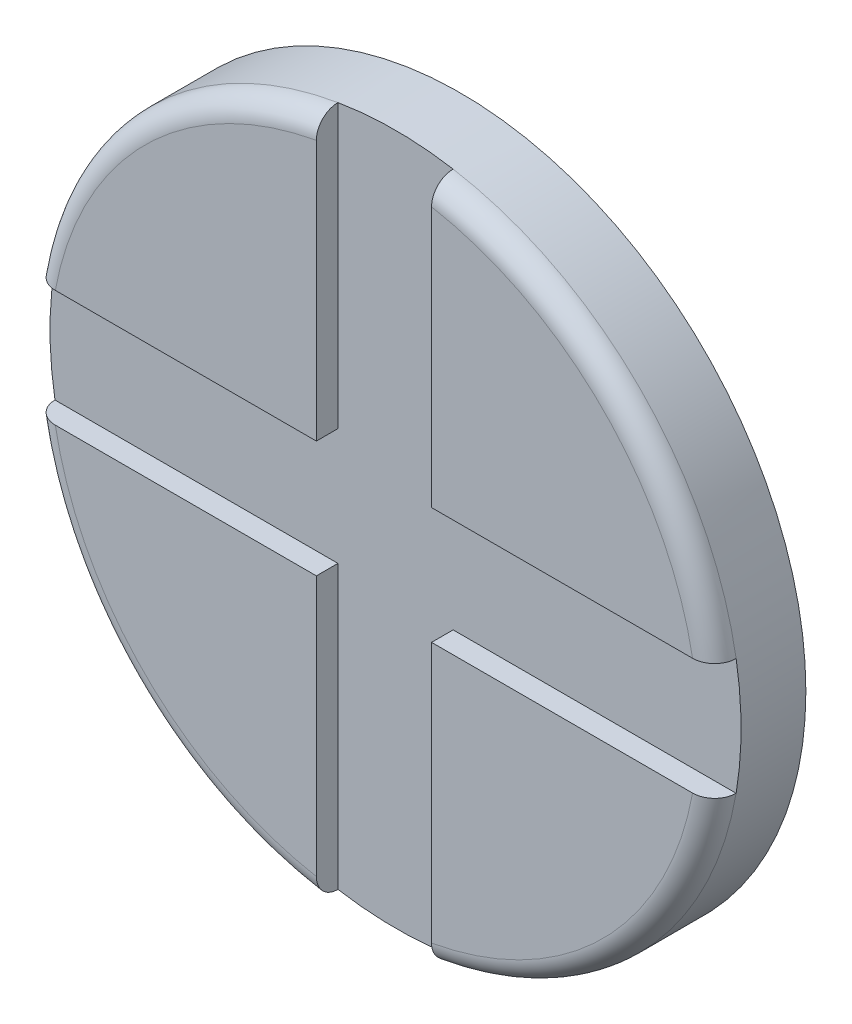
ISO-10303-21;
HEADER;
FILE_DESCRIPTION(('STEP AP214'),'2;1');
FILE_NAME('part.step','',(''),(''),'','','');
FILE_SCHEMA(('AUTOMOTIVE_DESIGN { 1 0 10303 214 1 1 1 1 }'));
ENDSEC;
DATA;
#1=APPLICATION_CONTEXT('core data for automotive mechanical design processes');
#2=APPLICATION_PROTOCOL_DEFINITION('international standard','automotive_design',2000,#1);
#3=PRODUCT_CONTEXT('',#1,'mechanical');
#4=PRODUCT('Part','Part','',(#3));
#5=PRODUCT_RELATED_PRODUCT_CATEGORY('part','',(#4));
#6=PRODUCT_DEFINITION_FORMATION('','',#4);
#7=PRODUCT_DEFINITION_CONTEXT('part definition',#1,'design');
#8=PRODUCT_DEFINITION('design','',#6,#7);
#9=PRODUCT_DEFINITION_SHAPE('','',#8);
#10=(LENGTH_UNIT() NAMED_UNIT(*) SI_UNIT(.MILLI.,.METRE.));
#11=(NAMED_UNIT(*) PLANE_ANGLE_UNIT() SI_UNIT($,.RADIAN.));
#12=(NAMED_UNIT(*) SI_UNIT($,.STERADIAN.) SOLID_ANGLE_UNIT());
#13=UNCERTAINTY_MEASURE_WITH_UNIT(LENGTH_MEASURE(1.E-05),#10,'distance_accuracy_value','');
#14=(GEOMETRIC_REPRESENTATION_CONTEXT(3) GLOBAL_UNCERTAINTY_ASSIGNED_CONTEXT((#13)) GLOBAL_UNIT_ASSIGNED_CONTEXT((#10,
#11,#12)) REPRESENTATION_CONTEXT('',''));
#15=CARTESIAN_POINT('',(0.,0.,0.));
#16=DIRECTION('',(0.,0.,1.));
#17=DIRECTION('',(1.,0.,0.));
#18=AXIS2_PLACEMENT_3D('',#15,#16,#17);
#19=CARTESIAN_POINT('',(0.,0.,1.));
#20=DIRECTION('',(0.,0.,1.));
#21=DIRECTION('',(1.,0.,0.));
#22=AXIS2_PLACEMENT_3D('',#19,#20,#21);
#23=PLANE('',#22);
#24=DIRECTION('',(0.,-1.,0.));
#25=VECTOR('',#24,1.);
#26=CARTESIAN_POINT('',(-0.666748585237763,0.,1.));
#27=LINE('',#26,#25);
#28=CARTESIAN_POINT('',(-0.666748585237763,3.69025017093468,1.));
#29=VERTEX_POINT('',#28);
#30=CARTESIAN_POINT('',(-0.666748585237763,0.675521592938265,1.));
#31=VERTEX_POINT('',#30);
#32=EDGE_CURVE('E223',#29,#31,#27,.T.);
#33=ORIENTED_EDGE('',*,*,#32,.F.);
#34=CARTESIAN_POINT('',(0.,0.,1.));
#35=DIRECTION('',(0.,0.,1.));
#36=DIRECTION('',(1.,0.,0.));
#37=AXIS2_PLACEMENT_3D('',#34,#35,#36);
#38=CIRCLE('',#37,3.75);
#39=CARTESIAN_POINT('',(-3.6886543044143,0.675521592938265,1.));
#40=VERTEX_POINT('',#39);
#41=EDGE_CURVE('E320',#29,#40,#38,.T.);
#42=ORIENTED_EDGE('',*,*,#41,.T.);
#43=DIRECTION('',(-1.,0.,0.));
#44=VECTOR('',#43,1.);
#45=CARTESIAN_POINT('',(-8.10625911525913,0.675521592938265,1.));
#46=LINE('',#45,#44);
#47=EDGE_CURVE('E148',#31,#40,#46,.T.);
#48=ORIENTED_EDGE('',*,*,#47,.F.);
#49=EDGE_LOOP('',(#33,#42,#48));
#50=FACE_BOUND('',#49,.T.);
#51=ADVANCED_FACE('F38',(#50),#23,.T.);
#52=DIRECTION('',(-1.,0.,0.));
#53=VECTOR('',#52,1.);
#54=CARTESIAN_POINT('',(0.,0.675521592938265,1.));
#55=LINE('',#54,#53);
#56=CARTESIAN_POINT('',(3.6886543044143,0.675521592938265,1.));
#57=VERTEX_POINT('',#56);
#58=CARTESIAN_POINT('',(0.666748585237763,0.675521592938265,1.));
#59=VERTEX_POINT('',#58);
#60=EDGE_CURVE('E220',#57,#59,#55,.T.);
#61=ORIENTED_EDGE('',*,*,#60,.F.);
#62=CARTESIAN_POINT('',(0.,0.,1.));
#63=DIRECTION('',(0.,0.,1.));
#64=DIRECTION('',(1.,0.,0.));
#65=AXIS2_PLACEMENT_3D('',#62,#63,#64);
#66=CIRCLE('',#65,3.75);
#67=CARTESIAN_POINT('',(0.666748585237763,3.69025017093468,1.));
#68=VERTEX_POINT('',#67);
#69=EDGE_CURVE('E232',#57,#68,#66,.T.);
#70=ORIENTED_EDGE('',*,*,#69,.T.);
#71=DIRECTION('',(0.,1.,0.));
#72=VECTOR('',#71,1.);
#73=CARTESIAN_POINT('',(0.666748585237763,0.675521592938265,1.));
#74=LINE('',#73,#72);
#75=EDGE_CURVE('E193',#59,#68,#74,.T.);
#76=ORIENTED_EDGE('',*,*,#75,.F.);
#77=EDGE_LOOP('',(#61,#70,#76));
#78=FACE_BOUND('',#77,.T.);
#79=ADVANCED_FACE('F339',(#78),#23,.T.);
#80=DIRECTION('',(0.,1.,0.));
#81=VECTOR('',#80,1.);
#82=CARTESIAN_POINT('',(0.666748585237763,0.,1.));
#83=LINE('',#82,#81);
#84=CARTESIAN_POINT('',(0.666748585237763,-3.69025017093468,1.));
#85=VERTEX_POINT('',#84);
#86=CARTESIAN_POINT('',(0.666748585237763,-0.675521592938265,1.));
#87=VERTEX_POINT('',#86);
#88=EDGE_CURVE('E217',#85,#87,#83,.T.);
#89=ORIENTED_EDGE('',*,*,#88,.F.);
#90=CARTESIAN_POINT('',(0.,0.,1.));
#91=DIRECTION('',(0.,0.,1.));
#92=DIRECTION('',(1.,0.,0.));
#93=AXIS2_PLACEMENT_3D('',#90,#91,#92);
#94=CIRCLE('',#93,3.75);
#95=CARTESIAN_POINT('',(3.6886543044143,-0.675521592938265,1.));
#96=VERTEX_POINT('',#95);
#97=EDGE_CURVE('E276',#85,#96,#94,.T.);
#98=ORIENTED_EDGE('',*,*,#97,.T.);
#99=DIRECTION('',(1.,0.,0.));
#100=VECTOR('',#99,1.);
#101=CARTESIAN_POINT('',(8.10625911525913,-0.675521592938265,1.));
#102=LINE('',#101,#100);
#103=EDGE_CURVE('E189',#87,#96,#102,.T.);
#104=ORIENTED_EDGE('',*,*,#103,.F.);
#105=EDGE_LOOP('',(#89,#98,#104));
#106=FACE_BOUND('',#105,.T.);
#107=ADVANCED_FACE('F331',(#106),#23,.T.);
#108=CARTESIAN_POINT('',(0.,0.,1.));
#109=DIRECTION('',(0.,0.,-1.));
#110=DIRECTION('',(-1.,0.,0.));
#111=AXIS2_PLACEMENT_3D('',#108,#109,#110);
#112=CYLINDRICAL_SURFACE('',#111,4.);
#113=CARTESIAN_POINT('',(0.,0.,0.75));
#114=DIRECTION('',(0.,0.,1.));
#115=DIRECTION('',(1.,0.,0.));
#116=AXIS2_PLACEMENT_3D('',#113,#114,#115);
#117=CIRCLE('',#116,4.);
#118=CARTESIAN_POINT('',(0.666748585237763,3.94403934109226,0.75));
#119=VERTEX_POINT('',#118);
#120=CARTESIAN_POINT('',(-0.666748585237763,3.94403934109226,0.75));
#121=VERTEX_POINT('',#120);
#122=EDGE_CURVE('E231',#119,#121,#117,.T.);
#123=ORIENTED_EDGE('',*,*,#122,.F.);
#124=CARTESIAN_POINT('',(0.,0.,0.75));
#125=DIRECTION('',(0.,0.,1.));
#126=DIRECTION('',(1.,0.,0.));
#127=AXIS2_PLACEMENT_3D('',#124,#125,#126);
#128=CIRCLE('',#127,4.);
#129=CARTESIAN_POINT('',(3.9425462048623,0.675521592938265,0.75));
#130=VERTEX_POINT('',#129);
#131=EDGE_CURVE('E277',#119,#130,#128,.F.);
#132=ORIENTED_EDGE('',*,*,#131,.T.);
#133=CARTESIAN_POINT('',(3.9425462048623,-0.675521592938265,0.75));
#134=VERTEX_POINT('',#133);
#135=EDGE_CURVE('E226',#134,#130,#117,.T.);
#136=ORIENTED_EDGE('',*,*,#135,.F.);
#137=CARTESIAN_POINT('',(0.,0.,0.75));
#138=DIRECTION('',(0.,0.,1.));
#139=DIRECTION('',(1.,0.,0.));
#140=AXIS2_PLACEMENT_3D('',#137,#138,#139);
#141=CIRCLE('',#140,4.);
#142=CARTESIAN_POINT('',(0.666748585237763,-3.94403934109226,0.75));
#143=VERTEX_POINT('',#142);
#144=EDGE_CURVE('E504',#134,#143,#141,.F.);
#145=ORIENTED_EDGE('',*,*,#144,.T.);
#146=CARTESIAN_POINT('',(-0.666748585237763,-3.94403934109226,0.75));
#147=VERTEX_POINT('',#146);
#148=EDGE_CURVE('E230',#147,#143,#117,.T.);
#149=ORIENTED_EDGE('',*,*,#148,.F.);
#150=CARTESIAN_POINT('',(0.,0.,0.75));
#151=DIRECTION('',(0.,0.,1.));
#152=DIRECTION('',(1.,0.,0.));
#153=AXIS2_PLACEMENT_3D('',#150,#151,#152);
#154=CIRCLE('',#153,4.);
#155=CARTESIAN_POINT('',(-3.9425462048623,-0.675521592938265,0.75));
#156=VERTEX_POINT('',#155);
#157=EDGE_CURVE('E511',#147,#156,#154,.F.);
#158=ORIENTED_EDGE('',*,*,#157,.T.);
#159=CARTESIAN_POINT('',(-3.9425462048623,0.675521592938265,0.75));
#160=VERTEX_POINT('',#159);
#161=EDGE_CURVE('E144',#160,#156,#117,.T.);
#162=ORIENTED_EDGE('',*,*,#161,.F.);
#163=CARTESIAN_POINT('',(0.,0.,0.75));
#164=DIRECTION('',(0.,0.,1.));
#165=DIRECTION('',(1.,0.,0.));
#166=AXIS2_PLACEMENT_3D('',#163,#164,#165);
#167=CIRCLE('',#166,4.);
#168=EDGE_CURVE('E245',#160,#121,#167,.F.);
#169=ORIENTED_EDGE('',*,*,#168,.T.);
#170=EDGE_LOOP('',(#123,#132,#136,#145,#149,#158,#162,#169));
#171=FACE_BOUND('',#170,.T.);
#172=CARTESIAN_POINT('',(0.,0.,0.));
#173=DIRECTION('',(0.,0.,1.));
#174=DIRECTION('',(1.,0.,0.));
#175=AXIS2_PLACEMENT_3D('',#172,#173,#174);
#176=CIRCLE('',#175,4.);
#177=CARTESIAN_POINT('',(4.,0.,0.));
#178=VERTEX_POINT('',#177);
#179=EDGE_CURVE('E204',#178,#178,#176,.T.);
#180=ORIENTED_EDGE('',*,*,#179,.T.);
#181=EDGE_LOOP('',(#180));
#182=FACE_BOUND('',#181,.T.);
#183=ADVANCED_FACE('F329',(#171,#182),#112,.T.);
#184=DIRECTION('',(1.,0.,0.));
#185=VECTOR('',#184,1.);
#186=CARTESIAN_POINT('',(0.,-0.675521592938265,1.));
#187=LINE('',#186,#185);
#188=CARTESIAN_POINT('',(-3.6886543044143,-0.675521592938265,1.));
#189=VERTEX_POINT('',#188);
#190=CARTESIAN_POINT('',(-0.666748585237763,-0.675521592938265,1.));
#191=VERTEX_POINT('',#190);
#192=EDGE_CURVE('E154',#189,#191,#187,.T.);
#193=ORIENTED_EDGE('',*,*,#192,.F.);
#194=CARTESIAN_POINT('',(0.,0.,1.));
#195=DIRECTION('',(0.,0.,1.));
#196=DIRECTION('',(1.,0.,0.));
#197=AXIS2_PLACEMENT_3D('',#194,#195,#196);
#198=CIRCLE('',#197,3.75);
#199=CARTESIAN_POINT('',(-0.666748585237763,-3.69025017093468,1.));
#200=VERTEX_POINT('',#199);
#201=EDGE_CURVE('E506',#189,#200,#198,.T.);
#202=ORIENTED_EDGE('',*,*,#201,.T.);
#203=DIRECTION('',(0.,-1.,0.));
#204=VECTOR('',#203,1.);
#205=CARTESIAN_POINT('',(-0.666748585237763,-0.675521592938265,1.));
#206=LINE('',#205,#204);
#207=EDGE_CURVE('E186',#191,#200,#206,.T.);
#208=ORIENTED_EDGE('',*,*,#207,.F.);
#209=EDGE_LOOP('',(#193,#202,#208));
#210=FACE_BOUND('',#209,.T.);
#211=ADVANCED_FACE('F325',(#210),#23,.T.);
#212=CARTESIAN_POINT('',(0.,0.,0.));
#213=DIRECTION('',(0.,0.,1.));
#214=DIRECTION('',(1.,0.,0.));
#215=AXIS2_PLACEMENT_3D('',#212,#213,#214);
#216=PLANE('',#215);
#217=ORIENTED_EDGE('',*,*,#179,.F.);
#218=EDGE_LOOP('',(#217));
#219=FACE_BOUND('',#218,.T.);
#220=ADVANCED_FACE('F328',(#219),#216,.F.);
#221=CARTESIAN_POINT('',(0.,0.,0.75));
#222=DIRECTION('',(0.,0.,1.));
#223=DIRECTION('',(1.,0.,0.));
#224=AXIS2_PLACEMENT_3D('',#221,#222,#223);
#225=PLANE('',#224);
#226=ORIENTED_EDGE('',*,*,#122,.T.);
#227=DIRECTION('',(0.,-1.,0.));
#228=VECTOR('',#227,1.);
#229=CARTESIAN_POINT('',(-0.666748585237763,0.675521592938265,0.75));
#230=LINE('',#229,#228);
#231=CARTESIAN_POINT('',(-0.666748585237763,0.675521592938265,0.75));
#232=VERTEX_POINT('',#231);
#233=EDGE_CURVE('E181',#121,#232,#230,.T.);
#234=ORIENTED_EDGE('',*,*,#233,.T.);
#235=DIRECTION('',(-1.,0.,0.));
#236=VECTOR('',#235,1.);
#237=CARTESIAN_POINT('',(-8.10625911525913,0.675521592938265,0.75));
#238=LINE('',#237,#236);
#239=EDGE_CURVE('E160',#232,#160,#238,.T.);
#240=ORIENTED_EDGE('',*,*,#239,.T.);
#241=ORIENTED_EDGE('',*,*,#161,.T.);
#242=DIRECTION('',(1.,0.,0.));
#243=VECTOR('',#242,1.);
#244=CARTESIAN_POINT('',(-8.10625911525913,-0.675521592938265,0.75));
#245=LINE('',#244,#243);
#246=CARTESIAN_POINT('',(-0.666748585237763,-0.675521592938265,0.75));
#247=VERTEX_POINT('',#246);
#248=EDGE_CURVE('E134',#156,#247,#245,.T.);
#249=ORIENTED_EDGE('',*,*,#248,.T.);
#250=DIRECTION('',(0.,-1.,0.));
#251=VECTOR('',#250,1.);
#252=CARTESIAN_POINT('',(-0.666748585237763,-0.675521592938265,0.75));
#253=LINE('',#252,#251);
#254=EDGE_CURVE('E140',#247,#147,#253,.T.);
#255=ORIENTED_EDGE('',*,*,#254,.T.);
#256=ORIENTED_EDGE('',*,*,#148,.T.);
#257=DIRECTION('',(0.,1.,0.));
#258=VECTOR('',#257,1.);
#259=CARTESIAN_POINT('',(0.666748585237763,-0.675521592938265,0.75));
#260=LINE('',#259,#258);
#261=CARTESIAN_POINT('',(0.666748585237763,-0.675521592938265,0.75));
#262=VERTEX_POINT('',#261);
#263=EDGE_CURVE('E165',#143,#262,#260,.T.);
#264=ORIENTED_EDGE('',*,*,#263,.T.);
#265=DIRECTION('',(1.,0.,0.));
#266=VECTOR('',#265,1.);
#267=CARTESIAN_POINT('',(8.10625911525913,-0.675521592938265,0.75));
#268=LINE('',#267,#266);
#269=EDGE_CURVE('E168',#262,#134,#268,.T.);
#270=ORIENTED_EDGE('',*,*,#269,.T.);
#271=ORIENTED_EDGE('',*,*,#135,.T.);
#272=DIRECTION('',(-1.,0.,0.));
#273=VECTOR('',#272,1.);
#274=CARTESIAN_POINT('',(8.10625911525913,0.675521592938265,0.75));
#275=LINE('',#274,#273);
#276=CARTESIAN_POINT('',(0.666748585237763,0.675521592938265,0.75));
#277=VERTEX_POINT('',#276);
#278=EDGE_CURVE('E174',#130,#277,#275,.T.);
#279=ORIENTED_EDGE('',*,*,#278,.T.);
#280=DIRECTION('',(0.,1.,0.));
#281=VECTOR('',#280,1.);
#282=CARTESIAN_POINT('',(0.666748585237763,0.675521592938265,0.75));
#283=LINE('',#282,#281);
#284=EDGE_CURVE('E177',#277,#119,#283,.T.);
#285=ORIENTED_EDGE('',*,*,#284,.T.);
#286=EDGE_LOOP('',(#226,#234,#240,#241,#249,#255,#256,#264,#270,#271,#279,#285));
#287=FACE_BOUND('',#286,.T.);
#288=ADVANCED_FACE('F137',(#287),#225,.T.);
#289=CARTESIAN_POINT('',(-8.10625911525913,0.675521592938265,0.75));
#290=DIRECTION('',(0.,1.,0.));
#291=DIRECTION('',(0.,0.,1.));
#292=AXIS2_PLACEMENT_3D('',#289,#290,#291);
#293=PLANE('',#292);
#294=ORIENTED_EDGE('',*,*,#47,.T.);
#295=CARTESIAN_POINT('',(-3.6886543044143,0.675521592938265,1.));
#296=CARTESIAN_POINT('',(-3.70310732693374,0.675521592938265,1.00001127598534));
#297=CARTESIAN_POINT('',(-3.71755855747042,0.675521592938265,0.998787956112983));
#298=CARTESIAN_POINT('',(-3.7460513541776,0.675521592938265,0.993950378422715));
#299=CARTESIAN_POINT('',(-3.76009303043003,0.675521592938265,0.990336769378082));
#300=CARTESIAN_POINT('',(-3.78737826603027,0.675521592938265,0.980793518963055));
#301=CARTESIAN_POINT('',(-3.80062127165866,0.675521592938265,0.974862291616754));
#302=CARTESIAN_POINT('',(-3.82590821675511,0.675521592938265,0.960844780389209));
#303=CARTESIAN_POINT('',(-3.83795255062412,0.675521592938265,0.952759208596884));
#304=CARTESIAN_POINT('',(-3.86039160695859,0.675521592938265,0.934726856361812));
#305=CARTESIAN_POINT('',(-3.87079924889062,0.675521592938265,0.924796160049689));
#306=CARTESIAN_POINT('',(-3.88977137986955,0.675521592938265,0.903302293427657));
#307=CARTESIAN_POINT('',(-3.89833556020725,0.675521592938265,0.891738850231263));
#308=CARTESIAN_POINT('',(-3.91324111555958,0.675521592938265,0.867492898699393));
#309=CARTESIAN_POINT('',(-3.91961311837463,0.675521592938265,0.854829193861606));
#310=CARTESIAN_POINT('',(-3.93010509521709,0.675521592938265,0.828605732312696));
#311=CARTESIAN_POINT('',(-3.93422686729584,0.675521592938265,0.815046700754817));
#312=CARTESIAN_POINT('',(-3.93895057283187,0.675521592938265,0.792821686490286));
#313=CARTESIAN_POINT('',(-3.94029818313135,0.675521592938265,0.784307176572258));
#314=CARTESIAN_POINT('',(-3.94209575964959,0.675521592938265,0.767196422330136));
#315=CARTESIAN_POINT('',(-3.94254702295186,0.675521592938265,0.758600314224204));
#316=CARTESIAN_POINT('',(-3.94254620486291,0.675521592938265,0.75000000000013));
#317=B_SPLINE_CURVE_WITH_KNOTS('',3,(#295,#296,#297,#298,#299,#300,#301,#302,#303,#304,#305,
#306,#307,#308,#309,#310,#311,#312,#313,#314,#315,#316),.UNSPECIFIED.,.F.,.F.,(4,2,2,2,2,2,2,2,
2,2,4),(0.,0.043305090437867,0.0865984318104516,0.129921451402074,0.173230168891926,
0.216177707870744,0.25913243333153,0.30146001145255,0.343753717950218,0.369572002496621,
0.395352898688334),.UNSPECIFIED.);
#318=EDGE_CURVE('E53',#40,#160,#317,.T.);
#319=ORIENTED_EDGE('',*,*,#318,.T.);
#320=ORIENTED_EDGE('',*,*,#239,.F.);
#321=DIRECTION('',(0.,0.,1.));
#322=VECTOR('',#321,1.);
#323=CARTESIAN_POINT('',(-0.666748585237763,0.675521592938265,0.75));
#324=LINE('',#323,#322);
#325=EDGE_CURVE('E200',#232,#31,#324,.T.);
#326=ORIENTED_EDGE('',*,*,#325,.T.);
#327=EDGE_LOOP('',(#294,#319,#320,#326));
#328=FACE_BOUND('',#327,.T.);
#329=ADVANCED_FACE('F360',(#328),#293,.F.);
#330=CARTESIAN_POINT('',(-0.666748585237763,0.675521592938265,0.75));
#331=DIRECTION('',(-1.,0.,0.));
#332=DIRECTION('',(0.,0.,1.));
#333=AXIS2_PLACEMENT_3D('',#330,#331,#332);
#334=PLANE('',#333);
#335=ORIENTED_EDGE('',*,*,#233,.F.);
#336=CARTESIAN_POINT('',(-0.666748585237763,3.94403934109226,0.75));
#337=CARTESIAN_POINT('',(-0.666748585237763,3.94405205652654,0.763919490419354));
#338=CARTESIAN_POINT('',(-0.666748585237763,3.94286112880237,0.777834314337653));
#339=CARTESIAN_POINT('',(-0.666748585237763,3.93816711508049,0.805252345670028));
#340=CARTESIAN_POINT('',(-0.666748585237763,3.93466672845274,0.81875601440157));
#341=CARTESIAN_POINT('',(-0.666748585237763,3.92544690266873,0.844988337710214));
#342=CARTESIAN_POINT('',(-0.666748585237763,3.91972668495071,0.857716718556322));
#343=CARTESIAN_POINT('',(-0.666748585237763,3.90624410138709,0.882039111517386));
#344=CARTESIAN_POINT('',(-0.666748585237763,3.89848187897486,0.893633203228018));
#345=CARTESIAN_POINT('',(-0.666748585237763,3.8810917768444,0.915437207278206));
#346=CARTESIAN_POINT('',(-0.666748585237763,3.87145320896662,0.925638591378647));
#347=CARTESIAN_POINT('',(-0.666748585237763,3.85061857653182,0.944305965555218));
#348=CARTESIAN_POINT('',(-0.666748585237763,3.83942218221737,0.952771587267843));
#349=CARTESIAN_POINT('',(-0.666748585237763,3.81563153434135,0.967847660627358));
#350=CARTESIAN_POINT('',(-0.666748585237763,3.80302044618687,0.974431516942081));
#351=CARTESIAN_POINT('',(-0.666748585237763,3.77688406350836,0.985419445689757));
#352=CARTESIAN_POINT('',(-0.666748585237763,3.76335909780451,0.989824297448384));
#353=CARTESIAN_POINT('',(-0.666748585237763,3.73985393572141,0.995383870522443));
#354=CARTESIAN_POINT('',(-0.666748585237763,3.7300057115501,0.997114146193454));
#355=CARTESIAN_POINT('',(-0.666748585237763,3.71018952598286,0.999422151464049));
#356=CARTESIAN_POINT('',(-0.666748585237763,3.70022175777955,1.00000153985163));
#357=CARTESIAN_POINT('',(-0.666748585237763,3.69025017093524,1.00000000000235));
#358=B_SPLINE_CURVE_WITH_KNOTS('',3,(#336,#337,#338,#339,#340,#341,#342,#343,#344,#345,#346,
#347,#348,#349,#350,#351,#352,#353,#354,#355,#356,#357),.UNSPECIFIED.,.F.,.F.,(4,2,2,2,2,2,2,2,
2,2,4),(0.,0.0417007199634953,0.083352784926031,0.125019471747011,0.16668323262046,
0.208591658693856,0.250508969389248,0.292992318204482,0.335460461753297,0.365394099536715,
0.39528456220413),.UNSPECIFIED.);
#359=EDGE_CURVE('E11',#121,#29,#358,.T.);
#360=ORIENTED_EDGE('',*,*,#359,.T.);
#361=ORIENTED_EDGE('',*,*,#32,.T.);
#362=ORIENTED_EDGE('',*,*,#325,.F.);
#363=EDGE_LOOP('',(#335,#360,#361,#362));
#364=FACE_BOUND('',#363,.T.);
#365=ADVANCED_FACE('F256',(#364),#334,.F.);
#366=CARTESIAN_POINT('',(0.666748585237763,0.675521592938265,0.75));
#367=DIRECTION('',(1.,0.,0.));
#368=DIRECTION('',(0.,0.,-1.));
#369=AXIS2_PLACEMENT_3D('',#366,#367,#368);
#370=PLANE('',#369);
#371=ORIENTED_EDGE('',*,*,#75,.T.);
#372=CARTESIAN_POINT('',(0.666748585237763,3.69025017093468,1.));
#373=CARTESIAN_POINT('',(0.666748585237763,3.70469281084056,1.00001129412914));
#374=CARTESIAN_POINT('',(0.666748585237763,3.71913361064892,0.998788652243084));
#375=CARTESIAN_POINT('',(0.666748585237763,3.74760557457344,0.993954018988125));
#376=CARTESIAN_POINT('',(0.666748585237763,3.76163685429154,0.990342708854178));
#377=CARTESIAN_POINT('',(0.666748585237763,3.78890178280757,0.980805937473574));
#378=CARTESIAN_POINT('',(0.666748585237763,3.80213488267888,0.974878904134002));
#379=CARTESIAN_POINT('',(0.666748585237763,3.82740323328719,0.960871882375406));
#380=CARTESIAN_POINT('',(0.666748585237763,3.83943887308997,0.952792596401267));
#381=CARTESIAN_POINT('',(0.666748585237763,3.86186510001276,0.934772894405005));
#382=CARTESIAN_POINT('',(0.666748585237763,3.87226824129386,0.924848109575875));
#383=CARTESIAN_POINT('',(0.666748585237763,3.89123325488261,0.90336738484439));
#384=CARTESIAN_POINT('',(0.666748585237763,3.8997948172229,0.891811170887603));
#385=CARTESIAN_POINT('',(0.666748585237763,3.91470069975872,0.867575813712456));
#386=CARTESIAN_POINT('',(0.666748585237763,3.92107479908467,0.854914961462661));
#387=CARTESIAN_POINT('',(0.666748585237763,3.93157227148094,0.828697029173902));
#388=CARTESIAN_POINT('',(0.666748585237763,3.93569742882055,0.815140669216964));
#389=CARTESIAN_POINT('',(0.666748585237763,3.94043138242656,0.79290259842064));
#390=CARTESIAN_POINT('',(0.666748585237763,3.94178361046471,0.784372176612822));
#391=CARTESIAN_POINT('',(0.666748585237763,3.94358735295009,0.767229147430427));
#392=CARTESIAN_POINT('',(0.666748585237763,3.9440401681882,0.758616676873956));
#393=CARTESIAN_POINT('',(0.666748585237763,3.94403934109288,0.750000000000133));
#394=B_SPLINE_CURVE_WITH_KNOTS('',3,(#372,#373,#374,#375,#376,#377,#378,#379,#380,#381,#382,
#383,#384,#385,#386,#387,#388,#389,#390,#391,#392,#393),.UNSPECIFIED.,.F.,.F.,(4,2,2,2,2,2,2,2,
2,2,4),(0.,0.0432738864839497,0.0865354368133695,0.129826407620303,0.173103266541659,
0.216029019001054,0.258961990910999,0.301284865599284,0.343574113048515,0.369441477109639,
0.39527140274089),.UNSPECIFIED.);
#395=EDGE_CURVE('E236',#68,#119,#394,.T.);
#396=ORIENTED_EDGE('',*,*,#395,.T.);
#397=ORIENTED_EDGE('',*,*,#284,.F.);
#398=DIRECTION('',(0.,0.,1.));
#399=VECTOR('',#398,1.);
#400=CARTESIAN_POINT('',(0.666748585237763,0.675521592938265,0.75));
#401=LINE('',#400,#399);
#402=EDGE_CURVE('E205',#277,#59,#401,.T.);
#403=ORIENTED_EDGE('',*,*,#402,.T.);
#404=EDGE_LOOP('',(#371,#396,#397,#403));
#405=FACE_BOUND('',#404,.T.);
#406=ADVANCED_FACE('F251',(#405),#370,.F.);
#407=CARTESIAN_POINT('',(8.10625911525913,0.675521592938265,0.75));
#408=DIRECTION('',(0.,1.,0.));
#409=DIRECTION('',(0.,0.,1.));
#410=AXIS2_PLACEMENT_3D('',#407,#408,#409);
#411=PLANE('',#410);
#412=ORIENTED_EDGE('',*,*,#278,.F.);
#413=CARTESIAN_POINT('',(3.9425462048623,0.675521592938265,0.75));
#414=CARTESIAN_POINT('',(3.94255894058925,0.675521592938265,0.763915625264494));
#415=CARTESIAN_POINT('',(3.9413682030949,0.675521592938265,0.777826554931893));
#416=CARTESIAN_POINT('',(3.9366750940775,0.675521592938265,0.805236716814336));
#417=CARTESIAN_POINT('',(3.93317544468873,0.675521592938265,0.818736414275551));
#418=CARTESIAN_POINT('',(3.92395781404857,0.675521592938265,0.844960931865921));
#419=CARTESIAN_POINT('',(3.91823906213503,0.675521592938265,0.857685481019141));
#420=CARTESIAN_POINT('',(3.90476033741523,0.675521592938265,0.882000736520251));
#421=CARTESIAN_POINT('',(3.89700050223459,0.675521592938265,0.893591519243183));
#422=CARTESIAN_POINT('',(3.8796149307387,0.675521592938265,0.91539152426081));
#423=CARTESIAN_POINT('',(3.86997823049034,0.675521592938265,0.925591998840834));
#424=CARTESIAN_POINT('',(3.84914800014811,0.675521592938265,0.944258545261076));
#425=CARTESIAN_POINT('',(3.83795413990232,0.675521592938265,0.952724248348021));
#426=CARTESIAN_POINT('',(3.81416496186739,0.675521592938265,0.967804716862133));
#427=CARTESIAN_POINT('',(3.80155237205977,0.675521592938265,0.974392205565351));
#428=CARTESIAN_POINT('',(3.77541266276666,0.675521592938265,0.985388008224851));
#429=CARTESIAN_POINT('',(3.76188586663449,0.675521592938265,0.989797088142711));
#430=CARTESIAN_POINT('',(3.73835930347153,0.675521592938265,0.995368837976903));
#431=CARTESIAN_POINT('',(3.72849116920664,0.675521592938265,0.997104757077041));
#432=CARTESIAN_POINT('',(3.70863459744868,0.675521592938265,0.99942028048439));
#433=CARTESIAN_POINT('',(3.69864635412222,0.675521592938265,1.00000154990282));
#434=CARTESIAN_POINT('',(3.68865430441487,0.675521592938265,1.00000000000239));
#435=B_SPLINE_CURVE_WITH_KNOTS('',3,(#413,#414,#415,#416,#417,#418,#419,#420,#421,#422,#423,
#424,#425,#426,#427,#428,#429,#430,#431,#432,#433,#434),.UNSPECIFIED.,.F.,.F.,(4,2,2,2,2,2,2,2,
2,2,4),(0.,0.0416890794059567,0.0833290963228446,0.12498358717499,0.166635270078732,
0.208537988166208,0.250449604124429,0.292942044137842,0.335419532512733,0.365414618347251,
0.395366417010936),.UNSPECIFIED.);
#436=EDGE_CURVE('E268',#130,#57,#435,.T.);
#437=ORIENTED_EDGE('',*,*,#436,.T.);
#438=ORIENTED_EDGE('',*,*,#60,.T.);
#439=ORIENTED_EDGE('',*,*,#402,.F.);
#440=EDGE_LOOP('',(#412,#437,#438,#439));
#441=FACE_BOUND('',#440,.T.);
#442=ADVANCED_FACE('F255',(#441),#411,.F.);
#443=CARTESIAN_POINT('',(8.10625911525913,-0.675521592938265,0.75));
#444=DIRECTION('',(0.,-1.,0.));
#445=DIRECTION('',(0.,0.,-1.));
#446=AXIS2_PLACEMENT_3D('',#443,#444,#445);
#447=PLANE('',#446);
#448=ORIENTED_EDGE('',*,*,#103,.T.);
#449=CARTESIAN_POINT('',(3.6886543044143,-0.675521592938265,1.));
#450=CARTESIAN_POINT('',(3.70310732693374,-0.675521592938265,1.00001127598534));
#451=CARTESIAN_POINT('',(3.71755855747042,-0.675521592938265,0.998787956112983));
#452=CARTESIAN_POINT('',(3.7460513541776,-0.675521592938265,0.993950378422715));
#453=CARTESIAN_POINT('',(3.76009303043003,-0.675521592938265,0.990336769378082));
#454=CARTESIAN_POINT('',(3.78737826603027,-0.675521592938265,0.980793518963055));
#455=CARTESIAN_POINT('',(3.80062127165866,-0.675521592938265,0.974862291616754));
#456=CARTESIAN_POINT('',(3.82590821675511,-0.675521592938265,0.960844780389209));
#457=CARTESIAN_POINT('',(3.83795255062412,-0.675521592938265,0.952759208596884));
#458=CARTESIAN_POINT('',(3.86039160695859,-0.675521592938265,0.934726856361812));
#459=CARTESIAN_POINT('',(3.87079924889062,-0.675521592938265,0.924796160049689));
#460=CARTESIAN_POINT('',(3.88977137986955,-0.675521592938265,0.903302293427657));
#461=CARTESIAN_POINT('',(3.89833556020725,-0.675521592938265,0.891738850231263));
#462=CARTESIAN_POINT('',(3.91324111555958,-0.675521592938265,0.867492898699393));
#463=CARTESIAN_POINT('',(3.91961311837463,-0.675521592938265,0.854829193861606));
#464=CARTESIAN_POINT('',(3.93010509521709,-0.675521592938265,0.828605732312696));
#465=CARTESIAN_POINT('',(3.93422686729584,-0.675521592938265,0.815046700754817));
#466=CARTESIAN_POINT('',(3.93895057283187,-0.675521592938265,0.792821686490286));
#467=CARTESIAN_POINT('',(3.94029818313135,-0.675521592938265,0.784307176572258));
#468=CARTESIAN_POINT('',(3.94209575964959,-0.675521592938265,0.767196422330136));
#469=CARTESIAN_POINT('',(3.94254702295186,-0.675521592938265,0.758600314224204));
#470=CARTESIAN_POINT('',(3.94254620486291,-0.675521592938265,0.75000000000013));
#471=B_SPLINE_CURVE_WITH_KNOTS('',3,(#449,#450,#451,#452,#453,#454,#455,#456,#457,#458,#459,
#460,#461,#462,#463,#464,#465,#466,#467,#468,#469,#470),.UNSPECIFIED.,.F.,.F.,(4,2,2,2,2,2,2,2,
2,2,4),(0.,0.043305090437867,0.0865984318104516,0.129921451402074,0.173230168891926,
0.216177707870744,0.25913243333153,0.30146001145255,0.343753717950218,0.369572002496621,
0.395352898688334),.UNSPECIFIED.);
#472=EDGE_CURVE('E282',#96,#134,#471,.T.);
#473=ORIENTED_EDGE('',*,*,#472,.T.);
#474=ORIENTED_EDGE('',*,*,#269,.F.);
#475=DIRECTION('',(0.,0.,1.));
#476=VECTOR('',#475,1.);
#477=CARTESIAN_POINT('',(0.666748585237763,-0.675521592938265,0.75));
#478=LINE('',#477,#476);
#479=EDGE_CURVE('E159',#262,#87,#478,.T.);
#480=ORIENTED_EDGE('',*,*,#479,.T.);
#481=EDGE_LOOP('',(#448,#473,#474,#480));
#482=FACE_BOUND('',#481,.T.);
#483=ADVANCED_FACE('F263',(#482),#447,.F.);
#484=CARTESIAN_POINT('',(0.666748585237763,-0.675521592938265,0.75));
#485=DIRECTION('',(1.,0.,0.));
#486=DIRECTION('',(0.,0.,-1.));
#487=AXIS2_PLACEMENT_3D('',#484,#485,#486);
#488=PLANE('',#487);
#489=ORIENTED_EDGE('',*,*,#263,.F.);
#490=CARTESIAN_POINT('',(0.666748585237763,-3.94403934109226,0.75));
#491=CARTESIAN_POINT('',(0.666748585237763,-3.94405205652654,0.763919490419354));
#492=CARTESIAN_POINT('',(0.666748585237763,-3.94286112880237,0.777834314337653));
#493=CARTESIAN_POINT('',(0.666748585237763,-3.93816711508049,0.805252345670028));
#494=CARTESIAN_POINT('',(0.666748585237763,-3.93466672845274,0.81875601440157));
#495=CARTESIAN_POINT('',(0.666748585237763,-3.92544690266873,0.844988337710214));
#496=CARTESIAN_POINT('',(0.666748585237763,-3.91972668495071,0.857716718556322));
#497=CARTESIAN_POINT('',(0.666748585237763,-3.90624410138709,0.882039111517386));
#498=CARTESIAN_POINT('',(0.666748585237763,-3.89848187897486,0.893633203228018));
#499=CARTESIAN_POINT('',(0.666748585237763,-3.8810917768444,0.915437207278206));
#500=CARTESIAN_POINT('',(0.666748585237763,-3.87145320896662,0.925638591378647));
#501=CARTESIAN_POINT('',(0.666748585237763,-3.85061857653182,0.944305965555218));
#502=CARTESIAN_POINT('',(0.666748585237763,-3.83942218221737,0.952771587267843));
#503=CARTESIAN_POINT('',(0.666748585237763,-3.81563153434135,0.967847660627358));
#504=CARTESIAN_POINT('',(0.666748585237763,-3.80302044618687,0.974431516942081));
#505=CARTESIAN_POINT('',(0.666748585237763,-3.77688406350836,0.985419445689757));
#506=CARTESIAN_POINT('',(0.666748585237763,-3.76335909780451,0.989824297448384));
#507=CARTESIAN_POINT('',(0.666748585237763,-3.73985393572141,0.995383870522443));
#508=CARTESIAN_POINT('',(0.666748585237763,-3.7300057115501,0.997114146193454));
#509=CARTESIAN_POINT('',(0.666748585237763,-3.71018952598286,0.999422151464049));
#510=CARTESIAN_POINT('',(0.666748585237763,-3.70022175777955,1.00000153985163));
#511=CARTESIAN_POINT('',(0.666748585237763,-3.69025017093524,1.00000000000235));
#512=B_SPLINE_CURVE_WITH_KNOTS('',3,(#490,#491,#492,#493,#494,#495,#496,#497,#498,#499,#500,
#501,#502,#503,#504,#505,#506,#507,#508,#509,#510,#511),.UNSPECIFIED.,.F.,.F.,(4,2,2,2,2,2,2,2,
2,2,4),(0.,0.0417007199634953,0.083352784926031,0.125019471747011,0.16668323262046,
0.208591658693856,0.250508969389248,0.292992318204482,0.335460461753297,0.365394099536715,
0.39528456220413),.UNSPECIFIED.);
#513=EDGE_CURVE('E289',#143,#85,#512,.T.);
#514=ORIENTED_EDGE('',*,*,#513,.T.);
#515=ORIENTED_EDGE('',*,*,#88,.T.);
#516=ORIENTED_EDGE('',*,*,#479,.F.);
#517=EDGE_LOOP('',(#489,#514,#515,#516));
#518=FACE_BOUND('',#517,.T.);
#519=ADVANCED_FACE('F392',(#518),#488,.F.);
#520=CARTESIAN_POINT('',(-0.666748585237763,-0.675521592938265,0.75));
#521=DIRECTION('',(-1.,0.,0.));
#522=DIRECTION('',(0.,0.,1.));
#523=AXIS2_PLACEMENT_3D('',#520,#521,#522);
#524=PLANE('',#523);
#525=ORIENTED_EDGE('',*,*,#207,.T.);
#526=CARTESIAN_POINT('',(-0.666748585237763,-3.69025017093468,1.));
#527=CARTESIAN_POINT('',(-0.666748585237763,-3.70469281084056,1.00001129412914));
#528=CARTESIAN_POINT('',(-0.666748585237763,-3.71913361064892,0.998788652243084));
#529=CARTESIAN_POINT('',(-0.666748585237763,-3.74760557457344,0.993954018988125));
#530=CARTESIAN_POINT('',(-0.666748585237763,-3.76163685429154,0.990342708854178));
#531=CARTESIAN_POINT('',(-0.666748585237763,-3.78890178280757,0.980805937473574));
#532=CARTESIAN_POINT('',(-0.666748585237763,-3.80213488267888,0.974878904134002));
#533=CARTESIAN_POINT('',(-0.666748585237763,-3.82740323328719,0.960871882375406));
#534=CARTESIAN_POINT('',(-0.666748585237763,-3.83943887308997,0.952792596401267));
#535=CARTESIAN_POINT('',(-0.666748585237763,-3.86186510001276,0.934772894405005));
#536=CARTESIAN_POINT('',(-0.666748585237763,-3.87226824129386,0.924848109575875));
#537=CARTESIAN_POINT('',(-0.666748585237763,-3.89123325488261,0.90336738484439));
#538=CARTESIAN_POINT('',(-0.666748585237763,-3.8997948172229,0.891811170887603));
#539=CARTESIAN_POINT('',(-0.666748585237763,-3.91470069975872,0.867575813712456));
#540=CARTESIAN_POINT('',(-0.666748585237763,-3.92107479908467,0.854914961462661));
#541=CARTESIAN_POINT('',(-0.666748585237763,-3.93157227148094,0.828697029173902));
#542=CARTESIAN_POINT('',(-0.666748585237763,-3.93569742882055,0.815140669216964));
#543=CARTESIAN_POINT('',(-0.666748585237763,-3.94043138242656,0.79290259842064));
#544=CARTESIAN_POINT('',(-0.666748585237763,-3.94178361046471,0.784372176612822));
#545=CARTESIAN_POINT('',(-0.666748585237763,-3.94358735295009,0.767229147430427));
#546=CARTESIAN_POINT('',(-0.666748585237763,-3.9440401681882,0.758616676873956));
#547=CARTESIAN_POINT('',(-0.666748585237763,-3.94403934109288,0.750000000000133));
#548=B_SPLINE_CURVE_WITH_KNOTS('',3,(#526,#527,#528,#529,#530,#531,#532,#533,#534,#535,#536,
#537,#538,#539,#540,#541,#542,#543,#544,#545,#546,#547),.UNSPECIFIED.,.F.,.F.,(4,2,2,2,2,2,2,2,
2,2,4),(0.,0.0432738864839497,0.0865354368133695,0.129826407620303,0.173103266541659,
0.216029019001054,0.258961990910999,0.301284865599284,0.343574113048515,0.369441477109639,
0.39527140274089),.UNSPECIFIED.);
#549=EDGE_CURVE('E163',#200,#147,#548,.T.);
#550=ORIENTED_EDGE('',*,*,#549,.T.);
#551=ORIENTED_EDGE('',*,*,#254,.F.);
#552=DIRECTION('',(0.,0.,1.));
#553=VECTOR('',#552,1.);
#554=CARTESIAN_POINT('',(-0.666748585237763,-0.675521592938265,0.75));
#555=LINE('',#554,#553);
#556=EDGE_CURVE('E151',#247,#191,#555,.T.);
#557=ORIENTED_EDGE('',*,*,#556,.T.);
#558=EDGE_LOOP('',(#525,#550,#551,#557));
#559=FACE_BOUND('',#558,.T.);
#560=ADVANCED_FACE('F162',(#559),#524,.F.);
#561=CARTESIAN_POINT('',(-8.10625911525913,-0.675521592938265,0.75));
#562=DIRECTION('',(0.,-1.,0.));
#563=DIRECTION('',(0.,0.,-1.));
#564=AXIS2_PLACEMENT_3D('',#561,#562,#563);
#565=PLANE('',#564);
#566=ORIENTED_EDGE('',*,*,#248,.F.);
#567=CARTESIAN_POINT('',(-3.9425462048623,-0.675521592938265,0.75));
#568=CARTESIAN_POINT('',(-3.94255894058925,-0.675521592938265,0.763915625264494));
#569=CARTESIAN_POINT('',(-3.9413682030949,-0.675521592938265,0.777826554931893));
#570=CARTESIAN_POINT('',(-3.9366750940775,-0.675521592938265,0.805236716814336));
#571=CARTESIAN_POINT('',(-3.93317544468873,-0.675521592938265,0.818736414275551));
#572=CARTESIAN_POINT('',(-3.92395781404857,-0.675521592938265,0.844960931865921));
#573=CARTESIAN_POINT('',(-3.91823906213503,-0.675521592938265,0.857685481019141));
#574=CARTESIAN_POINT('',(-3.90476033741523,-0.675521592938265,0.882000736520251));
#575=CARTESIAN_POINT('',(-3.89700050223459,-0.675521592938265,0.893591519243183));
#576=CARTESIAN_POINT('',(-3.8796149307387,-0.675521592938265,0.91539152426081));
#577=CARTESIAN_POINT('',(-3.86997823049034,-0.675521592938265,0.925591998840834));
#578=CARTESIAN_POINT('',(-3.84914800014811,-0.675521592938265,0.944258545261076));
#579=CARTESIAN_POINT('',(-3.83795413990232,-0.675521592938265,0.952724248348021));
#580=CARTESIAN_POINT('',(-3.81416496186739,-0.675521592938265,0.967804716862133));
#581=CARTESIAN_POINT('',(-3.80155237205977,-0.675521592938265,0.974392205565351));
#582=CARTESIAN_POINT('',(-3.77541266276666,-0.675521592938265,0.985388008224851));
#583=CARTESIAN_POINT('',(-3.76188586663449,-0.675521592938265,0.989797088142711));
#584=CARTESIAN_POINT('',(-3.73835930347153,-0.675521592938265,0.995368837976903));
#585=CARTESIAN_POINT('',(-3.72849116920664,-0.675521592938265,0.997104757077041));
#586=CARTESIAN_POINT('',(-3.70863459744868,-0.675521592938265,0.99942028048439));
#587=CARTESIAN_POINT('',(-3.69864635412222,-0.675521592938265,1.00000154990282));
#588=CARTESIAN_POINT('',(-3.68865430441487,-0.675521592938265,1.00000000000239));
#589=B_SPLINE_CURVE_WITH_KNOTS('',3,(#567,#568,#569,#570,#571,#572,#573,#574,#575,#576,#577,
#578,#579,#580,#581,#582,#583,#584,#585,#586,#587,#588),.UNSPECIFIED.,.F.,.F.,(4,2,2,2,2,2,2,2,
2,2,4),(0.,0.0416890794059567,0.0833290963228446,0.12498358717499,0.166635270078732,
0.208537988166208,0.250449604124429,0.292942044137842,0.335419532512733,0.365414618347251,
0.395366417010936),.UNSPECIFIED.);
#590=EDGE_CURVE('E312',#156,#189,#589,.T.);
#591=ORIENTED_EDGE('',*,*,#590,.T.);
#592=ORIENTED_EDGE('',*,*,#192,.T.);
#593=ORIENTED_EDGE('',*,*,#556,.F.);
#594=EDGE_LOOP('',(#566,#591,#592,#593));
#595=FACE_BOUND('',#594,.T.);
#596=ADVANCED_FACE('F152',(#595),#565,.F.);
#597=CARTESIAN_POINT('',(0.,0.,0.75));
#598=DIRECTION('',(0.,0.,1.));
#599=DIRECTION('',(1.,0.,0.));
#600=AXIS2_PLACEMENT_3D('',#597,#598,#599);
#601=TOROIDAL_SURFACE('',#600,3.75,0.25);
#602=ORIENTED_EDGE('',*,*,#436,.F.);
#603=ORIENTED_EDGE('',*,*,#131,.F.);
#604=ORIENTED_EDGE('',*,*,#395,.F.);
#605=ORIENTED_EDGE('',*,*,#69,.F.);
#606=EDGE_LOOP('',(#602,#603,#604,#605));
#607=FACE_BOUND('',#606,.T.);
#608=ADVANCED_FACE('F247',(#607),#601,.T.);
#609=CARTESIAN_POINT('',(0.,0.,0.75));
#610=DIRECTION('',(0.,0.,1.));
#611=DIRECTION('',(1.,0.,0.));
#612=AXIS2_PLACEMENT_3D('',#609,#610,#611);
#613=TOROIDAL_SURFACE('',#612,3.75,0.25);
#614=ORIENTED_EDGE('',*,*,#513,.F.);
#615=ORIENTED_EDGE('',*,*,#144,.F.);
#616=ORIENTED_EDGE('',*,*,#472,.F.);
#617=ORIENTED_EDGE('',*,*,#97,.F.);
#618=EDGE_LOOP('',(#614,#615,#616,#617));
#619=FACE_BOUND('',#618,.T.);
#620=ADVANCED_FACE('F295',(#619),#613,.T.);
#621=CARTESIAN_POINT('',(0.,0.,0.75));
#622=DIRECTION('',(0.,0.,1.));
#623=DIRECTION('',(1.,0.,0.));
#624=AXIS2_PLACEMENT_3D('',#621,#622,#623);
#625=TOROIDAL_SURFACE('',#624,3.75,0.25);
#626=ORIENTED_EDGE('',*,*,#590,.F.);
#627=ORIENTED_EDGE('',*,*,#157,.F.);
#628=ORIENTED_EDGE('',*,*,#549,.F.);
#629=ORIENTED_EDGE('',*,*,#201,.F.);
#630=EDGE_LOOP('',(#626,#627,#628,#629));
#631=FACE_BOUND('',#630,.T.);
#632=ADVANCED_FACE('F298',(#631),#625,.T.);
#633=CARTESIAN_POINT('',(0.,0.,0.75));
#634=DIRECTION('',(0.,0.,1.));
#635=DIRECTION('',(1.,0.,0.));
#636=AXIS2_PLACEMENT_3D('',#633,#634,#635);
#637=TOROIDAL_SURFACE('',#636,3.75,0.25);
#638=ORIENTED_EDGE('',*,*,#359,.F.);
#639=ORIENTED_EDGE('',*,*,#168,.F.);
#640=ORIENTED_EDGE('',*,*,#318,.F.);
#641=ORIENTED_EDGE('',*,*,#41,.F.);
#642=EDGE_LOOP('',(#638,#639,#640,#641));
#643=FACE_BOUND('',#642,.T.);
#644=ADVANCED_FACE('F40',(#643),#637,.T.);
#645=CLOSED_SHELL('',(#51,#79,#107,#183,#211,#220,#288,#329,#365,#406,#442,#483,#519,#560,#596,
#608,#620,#632,#644));
#646=MANIFOLD_SOLID_BREP('B2',#645);
#647=ADVANCED_BREP_SHAPE_REPRESENTATION('',(#18,#646),#14);
#648=SHAPE_DEFINITION_REPRESENTATION(#9,#647);
ENDSEC;
END-ISO-10303-21;
